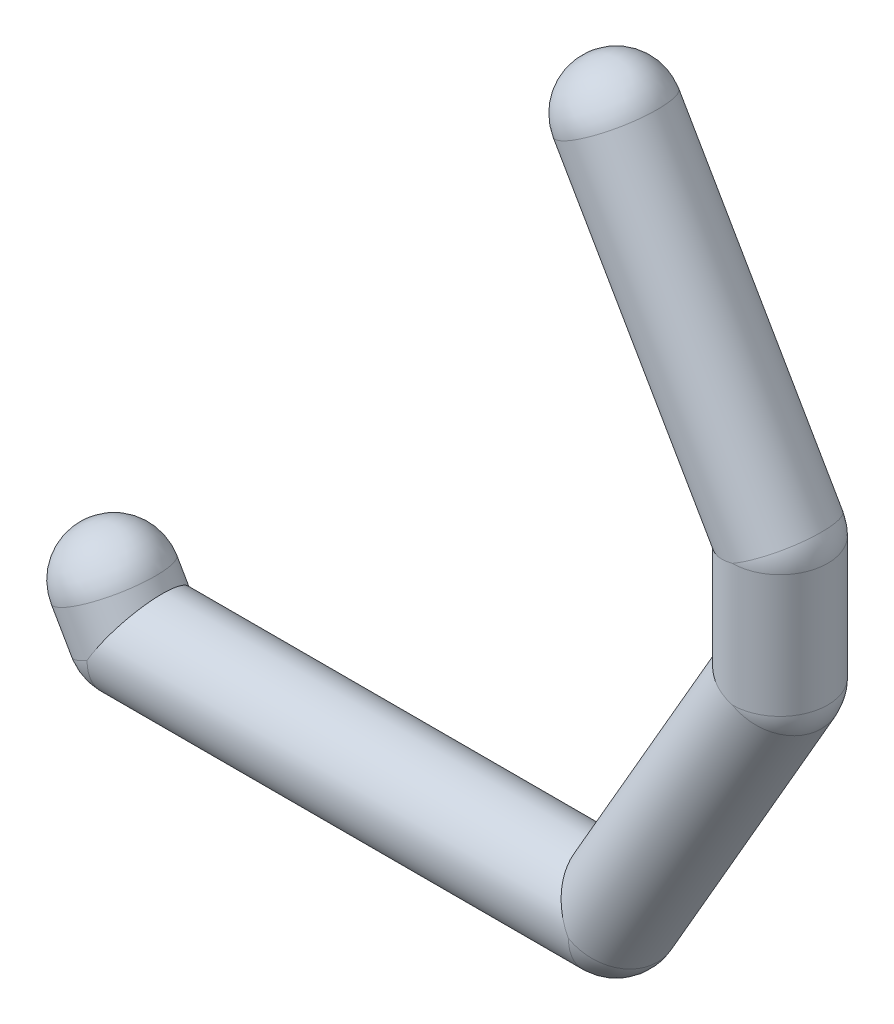
ISO-10303-21;
HEADER;
FILE_DESCRIPTION(('STEP AP214'),'2;1');
FILE_NAME('part.step','',(''),(''),'','','');
FILE_SCHEMA(('AUTOMOTIVE_DESIGN { 1 0 10303 214 1 1 1 1 }'));
ENDSEC;
DATA;
#1=APPLICATION_CONTEXT('core data for automotive mechanical design processes');
#2=APPLICATION_PROTOCOL_DEFINITION('international standard','automotive_design',2000,#1);
#3=PRODUCT_CONTEXT('',#1,'mechanical');
#4=PRODUCT('Part','Part','',(#3));
#5=PRODUCT_RELATED_PRODUCT_CATEGORY('part','',(#4));
#6=PRODUCT_DEFINITION_FORMATION('','',#4);
#7=PRODUCT_DEFINITION_CONTEXT('part definition',#1,'design');
#8=PRODUCT_DEFINITION('design','',#6,#7);
#9=PRODUCT_DEFINITION_SHAPE('','',#8);
#10=(LENGTH_UNIT() NAMED_UNIT(*) SI_UNIT(.MILLI.,.METRE.));
#11=(NAMED_UNIT(*) PLANE_ANGLE_UNIT() SI_UNIT($,.RADIAN.));
#12=(NAMED_UNIT(*) SI_UNIT($,.STERADIAN.) SOLID_ANGLE_UNIT());
#13=UNCERTAINTY_MEASURE_WITH_UNIT(LENGTH_MEASURE(1.E-05),#10,'distance_accuracy_value','');
#14=(GEOMETRIC_REPRESENTATION_CONTEXT(3) GLOBAL_UNCERTAINTY_ASSIGNED_CONTEXT((#13)) GLOBAL_UNIT_ASSIGNED_CONTEXT((#10,
#11,#12)) REPRESENTATION_CONTEXT('',''));
#15=CARTESIAN_POINT('',(0.,0.,0.));
#16=DIRECTION('',(0.,0.,1.));
#17=DIRECTION('',(1.,0.,0.));
#18=AXIS2_PLACEMENT_3D('',#15,#16,#17);
#19=CARTESIAN_POINT('',(18.741,-5.4,1.725));
#20=DIRECTION('',(1.,0.,0.));
#21=DIRECTION('',(0.,-1.,0.));
#22=AXIS2_PLACEMENT_3D('',#19,#20,#21);
#23=SPHERICAL_SURFACE('',#22,0.24);
#24=CARTESIAN_POINT('',(18.741,-5.4,1.725));
#25=DIRECTION('',(-0.500277597874621,0.865865073244555,0.));
#26=DIRECTION('',(-0.865865073244555,-0.500277597874621,0.));
#27=AXIS2_PLACEMENT_3D('',#24,#25,#26);
#28=CIRCLE('',#27,0.240000000000001);
#29=CARTESIAN_POINT('',(18.741,-5.4,1.485));
#30=VERTEX_POINT('',#29);
#31=CARTESIAN_POINT('',(18.741,-5.4,1.965));
#32=VERTEX_POINT('',#31);
#33=EDGE_CURVE('E102',#30,#32,#28,.T.);
#34=ORIENTED_EDGE('',*,*,#33,.F.);
#35=CARTESIAN_POINT('',(18.741,-5.4,1.725));
#36=DIRECTION('',(-1.,0.,0.));
#37=DIRECTION('',(0.,0.,1.));
#38=AXIS2_PLACEMENT_3D('',#35,#36,#37);
#39=CIRCLE('',#38,0.24);
#40=EDGE_CURVE('E103',#32,#30,#39,.F.);
#41=ORIENTED_EDGE('',*,*,#40,.F.);
#42=EDGE_LOOP('',(#34,#41));
#43=FACE_BOUND('',#42,.T.);
#44=ADVANCED_FACE('F63',(#43),#23,.T.);
#45=CARTESIAN_POINT('',(21.166,-5.4,1.725));
#46=DIRECTION('',(-1.,0.,0.));
#47=DIRECTION('',(0.,0.,1.));
#48=AXIS2_PLACEMENT_3D('',#45,#46,#47);
#49=CYLINDRICAL_SURFACE('',#48,0.24);
#50=CARTESIAN_POINT('',(18.741,-5.4,1.725));
#51=DIRECTION('',(-0.866105535681024,0.499861181792191,0.));
#52=DIRECTION('',(-0.499861181792191,-0.866105535681024,0.));
#53=AXIS2_PLACEMENT_3D('',#50,#51,#52);
#54=ELLIPSE('',#53,0.277102489376525,0.24);
#55=EDGE_CURVE('E76',#32,#30,#54,.T.);
#56=ORIENTED_EDGE('',*,*,#55,.F.);
#57=ORIENTED_EDGE('',*,*,#40,.T.);
#58=EDGE_LOOP('',(#56,#57));
#59=FACE_BOUND('',#58,.T.);
#60=CARTESIAN_POINT('',(21.166,-5.4,1.725));
#61=DIRECTION('',(-0.866000737383216,-0.500042721026639,0.));
#62=DIRECTION('',(-0.50004272102664,0.866000737383216,0.));
#63=AXIS2_PLACEMENT_3D('',#60,#61,#62);
#64=ELLIPSE('',#63,0.277136022684236,0.24);
#65=CARTESIAN_POINT('',(21.166,-5.4,1.485));
#66=VERTEX_POINT('',#65);
#67=CARTESIAN_POINT('',(21.166,-5.4,1.965));
#68=VERTEX_POINT('',#67);
#69=EDGE_CURVE('E70',#66,#68,#64,.F.);
#70=ORIENTED_EDGE('',*,*,#69,.F.);
#71=CARTESIAN_POINT('',(21.166,-5.4,1.725));
#72=DIRECTION('',(-1.,0.,0.));
#73=DIRECTION('',(0.,0.,1.));
#74=AXIS2_PLACEMENT_3D('',#71,#72,#73);
#75=CIRCLE('',#74,0.24);
#76=EDGE_CURVE('E107',#66,#68,#75,.T.);
#77=ORIENTED_EDGE('',*,*,#76,.T.);
#78=EDGE_LOOP('',(#70,#77));
#79=FACE_BOUND('',#78,.T.);
#80=ADVANCED_FACE('F106',(#59,#79),#49,.T.);
#81=CARTESIAN_POINT('',(21.166,-5.4,1.725));
#82=DIRECTION('',(1.,0.,0.));
#83=DIRECTION('',(0.,-1.,0.));
#84=AXIS2_PLACEMENT_3D('',#81,#82,#83);
#85=SPHERICAL_SURFACE('',#84,0.24);
#86=ORIENTED_EDGE('',*,*,#76,.F.);
#87=CARTESIAN_POINT('',(21.166,-5.4,1.725));
#88=DIRECTION('',(-0.499914554296549,-0.86607473026436,0.));
#89=DIRECTION('',(0.86607473026436,-0.499914554296549,0.));
#90=AXIS2_PLACEMENT_3D('',#87,#88,#89);
#91=CIRCLE('',#90,0.24);
#92=EDGE_CURVE('E128',#68,#66,#91,.F.);
#93=ORIENTED_EDGE('',*,*,#92,.F.);
#94=EDGE_LOOP('',(#86,#93));
#95=FACE_BOUND('',#94,.T.);
#96=ADVANCED_FACE('F138',(#95),#85,.T.);
#97=CARTESIAN_POINT('',(21.992,-3.96899999999999,1.725));
#98=DIRECTION('',(-0.499914554296549,-0.86607473026436,0.));
#99=DIRECTION('',(0.86607473026436,-0.499914554296549,0.));
#100=AXIS2_PLACEMENT_3D('',#97,#98,#99);
#101=CYLINDRICAL_SURFACE('',#100,0.24);
#102=CARTESIAN_POINT('',(21.992,-3.96899999999999,1.725));
#103=DIRECTION('',(-0.258771394995313,-0.965938592837133,0.));
#104=DIRECTION('',(-0.965938592837133,0.258771394995313,0.));
#105=AXIS2_PLACEMENT_3D('',#102,#103,#104);
#106=ELLIPSE('',#105,0.248462999387029,0.24);
#107=CARTESIAN_POINT('',(21.992,-3.96899999999999,1.485));
#108=VERTEX_POINT('',#107);
#109=CARTESIAN_POINT('',(21.992,-3.969,1.965));
#110=VERTEX_POINT('',#109);
#111=EDGE_CURVE('E131',#108,#110,#106,.F.);
#112=ORIENTED_EDGE('',*,*,#111,.F.);
#113=CARTESIAN_POINT('',(21.992,-3.96899999999999,1.725));
#114=DIRECTION('',(-0.499914554296552,-0.866074730264358,0.));
#115=DIRECTION('',(0.866074730264358,-0.499914554296552,0.));
#116=AXIS2_PLACEMENT_3D('',#113,#114,#115);
#117=CIRCLE('',#116,0.24);
#118=EDGE_CURVE('E126',#108,#110,#117,.T.);
#119=ORIENTED_EDGE('',*,*,#118,.T.);
#120=EDGE_LOOP('',(#112,#119));
#121=FACE_BOUND('',#120,.T.);
#122=ORIENTED_EDGE('',*,*,#92,.T.);
#123=ORIENTED_EDGE('',*,*,#69,.T.);
#124=EDGE_LOOP('',(#122,#123));
#125=FACE_BOUND('',#124,.T.);
#126=ADVANCED_FACE('F136',(#121,#125),#101,.T.);
#127=CARTESIAN_POINT('',(21.992,-3.969,1.725));
#128=DIRECTION('',(1.,0.,0.));
#129=DIRECTION('',(0.,-1.,0.));
#130=AXIS2_PLACEMENT_3D('',#127,#128,#129);
#131=SPHERICAL_SURFACE('',#130,0.24);
#132=ORIENTED_EDGE('',*,*,#118,.F.);
#133=CARTESIAN_POINT('',(21.992,-3.969,1.725));
#134=DIRECTION('',(0.,-1.,0.));
#135=DIRECTION('',(0.,0.,-1.));
#136=AXIS2_PLACEMENT_3D('',#133,#134,#135);
#137=CIRCLE('',#136,0.24);
#138=EDGE_CURVE('E120',#110,#108,#137,.F.);
#139=ORIENTED_EDGE('',*,*,#138,.F.);
#140=EDGE_LOOP('',(#132,#139));
#141=FACE_BOUND('',#140,.T.);
#142=ADVANCED_FACE('F152',(#141),#131,.T.);
#143=CARTESIAN_POINT('',(21.992,-3.351,1.725));
#144=DIRECTION('',(0.,-1.,0.));
#145=DIRECTION('',(0.,0.,-1.));
#146=AXIS2_PLACEMENT_3D('',#143,#144,#145);
#147=CYLINDRICAL_SURFACE('',#146,0.240000000000001);
#148=CARTESIAN_POINT('',(21.992,-3.35100000000001,1.725));
#149=DIRECTION('',(0.258771394995313,-0.965938592837132,0.));
#150=DIRECTION('',(-0.965938592837132,-0.258771394995313,0.));
#151=AXIS2_PLACEMENT_3D('',#148,#149,#150);
#152=ELLIPSE('',#151,0.248462999387029,0.24);
#153=CARTESIAN_POINT('',(21.992,-3.351,1.485));
#154=VERTEX_POINT('',#153);
#155=CARTESIAN_POINT('',(21.992,-3.351,1.965));
#156=VERTEX_POINT('',#155);
#157=EDGE_CURVE('E123',#154,#156,#152,.F.);
#158=ORIENTED_EDGE('',*,*,#157,.F.);
#159=CARTESIAN_POINT('',(21.992,-3.351,1.725));
#160=DIRECTION('',(0.,-1.,0.));
#161=DIRECTION('',(0.,0.,-1.));
#162=AXIS2_PLACEMENT_3D('',#159,#160,#161);
#163=CIRCLE('',#162,0.240000000000001);
#164=EDGE_CURVE('E117',#154,#156,#163,.T.);
#165=ORIENTED_EDGE('',*,*,#164,.T.);
#166=EDGE_LOOP('',(#158,#165));
#167=FACE_BOUND('',#166,.T.);
#168=ORIENTED_EDGE('',*,*,#138,.T.);
#169=ORIENTED_EDGE('',*,*,#111,.T.);
#170=EDGE_LOOP('',(#168,#169));
#171=FACE_BOUND('',#170,.T.);
#172=ADVANCED_FACE('F156',(#167,#171),#147,.T.);
#173=CARTESIAN_POINT('',(21.992,-3.351,1.725));
#174=DIRECTION('',(1.,0.,0.));
#175=DIRECTION('',(0.,-1.,0.));
#176=AXIS2_PLACEMENT_3D('',#173,#174,#175);
#177=SPHERICAL_SURFACE('',#176,0.24);
#178=ORIENTED_EDGE('',*,*,#164,.F.);
#179=CARTESIAN_POINT('',(21.992,-3.35100000000001,1.725));
#180=DIRECTION('',(0.499914554296552,-0.866074730264358,0.));
#181=DIRECTION('',(0.866074730264358,0.499914554296552,0.));
#182=AXIS2_PLACEMENT_3D('',#179,#180,#181);
#183=CIRCLE('',#182,0.24);
#184=EDGE_CURVE('E113',#154,#156,#183,.T.);
#185=ORIENTED_EDGE('',*,*,#184,.T.);
#186=EDGE_LOOP('',(#178,#185));
#187=FACE_BOUND('',#186,.T.);
#188=ADVANCED_FACE('F160',(#187),#177,.T.);
#189=CARTESIAN_POINT('',(21.166,-1.92000000000001,1.725));
#190=DIRECTION('',(0.499914554296549,-0.86607473026436,0.));
#191=DIRECTION('',(0.86607473026436,0.499914554296549,0.));
#192=AXIS2_PLACEMENT_3D('',#189,#190,#191);
#193=CYLINDRICAL_SURFACE('',#192,0.24);
#194=ORIENTED_EDGE('',*,*,#184,.F.);
#195=ORIENTED_EDGE('',*,*,#157,.T.);
#196=EDGE_LOOP('',(#194,#195));
#197=FACE_BOUND('',#196,.T.);
#198=CARTESIAN_POINT('',(21.166,-1.92000000000001,1.725));
#199=DIRECTION('',(0.499914554296552,-0.866074730264358,0.));
#200=DIRECTION('',(0.866074730264358,0.499914554296552,0.));
#201=AXIS2_PLACEMENT_3D('',#198,#199,#200);
#202=CIRCLE('',#201,0.24);
#203=CARTESIAN_POINT('',(21.3738579352634,-1.80002050696883,1.725));
#204=VERTEX_POINT('',#203);
#205=EDGE_CURVE('E110',#204,#204,#202,.T.);
#206=ORIENTED_EDGE('',*,*,#205,.T.);
#207=EDGE_LOOP('',(#206));
#208=FACE_BOUND('',#207,.T.);
#209=ADVANCED_FACE('F165',(#197,#208),#193,.T.);
#210=CARTESIAN_POINT('',(21.166,-1.92,1.725));
#211=DIRECTION('',(1.,0.,0.));
#212=DIRECTION('',(0.,-1.,0.));
#213=AXIS2_PLACEMENT_3D('',#210,#211,#212);
#214=SPHERICAL_SURFACE('',#213,0.24);
#215=CARTESIAN_POINT('',(21.166,-1.92,1.725));
#216=DIRECTION('',(0.499914554296552,-0.866074730264358,0.));
#217=DIRECTION('',(0.866074730264358,0.499914554296552,0.));
#218=AXIS2_PLACEMENT_3D('',#215,#216,#217);
#219=SPHERICAL_SURFACE('',#218,0.24);
#220=ORIENTED_EDGE('',*,*,#205,.F.);
#221=EDGE_LOOP('',(#220));
#222=FACE_BOUND('',#221,.T.);
#223=ADVANCED_FACE('F162',(#222),#219,.T.);
#224=CARTESIAN_POINT('',(18.741,-5.4,1.725));
#225=DIRECTION('',(-0.500277597874628,0.865865073244551,0.));
#226=DIRECTION('',(-0.865865073244551,-0.500277597874628,0.));
#227=AXIS2_PLACEMENT_3D('',#224,#225,#226);
#228=CYLINDRICAL_SURFACE('',#227,0.240000000000001);
#229=CARTESIAN_POINT('',(18.637,-5.22,1.725));
#230=DIRECTION('',(-0.500277597874628,0.865865073244551,0.));
#231=DIRECTION('',(-0.865865073244551,-0.500277597874628,0.));
#232=AXIS2_PLACEMENT_3D('',#229,#230,#231);
#233=CIRCLE('',#232,0.24);
#234=CARTESIAN_POINT('',(18.4291923824213,-5.34006662348991,1.725));
#235=VERTEX_POINT('',#234);
#236=EDGE_CURVE('E12',#235,#235,#233,.F.);
#237=ORIENTED_EDGE('',*,*,#236,.T.);
#238=EDGE_LOOP('',(#237));
#239=FACE_BOUND('',#238,.T.);
#240=ORIENTED_EDGE('',*,*,#33,.T.);
#241=ORIENTED_EDGE('',*,*,#55,.T.);
#242=EDGE_LOOP('',(#240,#241));
#243=FACE_BOUND('',#242,.T.);
#244=ADVANCED_FACE('F109',(#239,#243),#228,.T.);
#245=CARTESIAN_POINT('',(18.637,-5.22,1.725));
#246=DIRECTION('',(1.,0.,0.));
#247=DIRECTION('',(0.,-1.,0.));
#248=AXIS2_PLACEMENT_3D('',#245,#246,#247);
#249=SPHERICAL_SURFACE('',#248,0.24);
#250=CARTESIAN_POINT('',(18.637,-5.22,1.725));
#251=DIRECTION('',(-0.500277597874628,0.865865073244551,0.));
#252=DIRECTION('',(-0.865865073244551,-0.500277597874628,0.));
#253=AXIS2_PLACEMENT_3D('',#250,#251,#252);
#254=SPHERICAL_SURFACE('',#253,0.24);
#255=ORIENTED_EDGE('',*,*,#236,.F.);
#256=EDGE_LOOP('',(#255));
#257=FACE_BOUND('',#256,.T.);
#258=ADVANCED_FACE('F146',(#257),#254,.T.);
#259=CLOSED_SHELL('',(#44,#80,#96,#126,#142,#172,#188,#209,#223,#244,#258));
#260=MANIFOLD_SOLID_BREP('B2',#259);
#261=ADVANCED_BREP_SHAPE_REPRESENTATION('',(#18,#260),#14);
#262=SHAPE_DEFINITION_REPRESENTATION(#9,#261);
ENDSEC;
END-ISO-10303-21;
